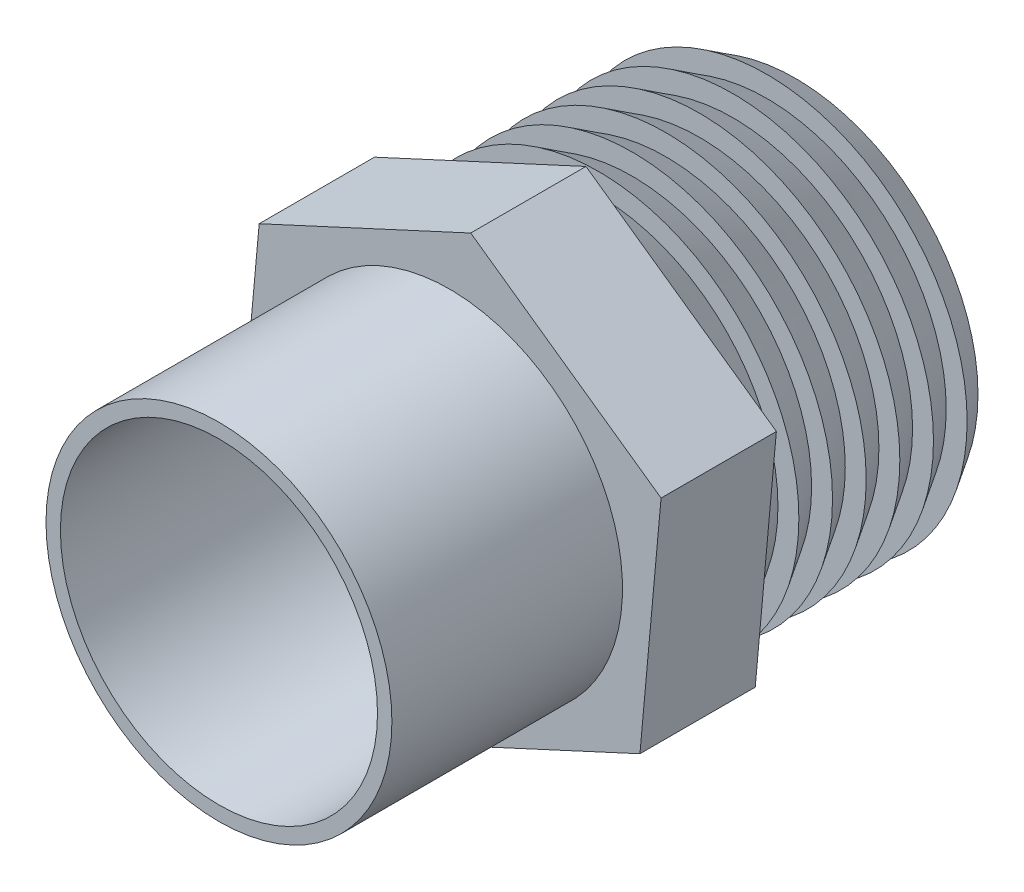
ISO-10303-21;
HEADER;
FILE_DESCRIPTION(('STEP AP214'),'2;1');
FILE_NAME('part.step','',(''),(''),'','','');
FILE_SCHEMA(('AUTOMOTIVE_DESIGN { 1 0 10303 214 1 1 1 1 }'));
ENDSEC;
DATA;
#1=APPLICATION_CONTEXT('core data for automotive mechanical design processes');
#2=APPLICATION_PROTOCOL_DEFINITION('international standard','automotive_design',2000,#1);
#3=PRODUCT_CONTEXT('',#1,'mechanical');
#4=PRODUCT('Part','Part','',(#3));
#5=PRODUCT_RELATED_PRODUCT_CATEGORY('part','',(#4));
#6=PRODUCT_DEFINITION_FORMATION('','',#4);
#7=PRODUCT_DEFINITION_CONTEXT('part definition',#1,'design');
#8=PRODUCT_DEFINITION('design','',#6,#7);
#9=PRODUCT_DEFINITION_SHAPE('','',#8);
#10=(LENGTH_UNIT() NAMED_UNIT(*) SI_UNIT(.MILLI.,.METRE.));
#11=(NAMED_UNIT(*) PLANE_ANGLE_UNIT() SI_UNIT($,.RADIAN.));
#12=(NAMED_UNIT(*) SI_UNIT($,.STERADIAN.) SOLID_ANGLE_UNIT());
#13=UNCERTAINTY_MEASURE_WITH_UNIT(LENGTH_MEASURE(1.E-05),#10,'distance_accuracy_value','');
#14=(GEOMETRIC_REPRESENTATION_CONTEXT(3) GLOBAL_UNCERTAINTY_ASSIGNED_CONTEXT((#13)) GLOBAL_UNIT_ASSIGNED_CONTEXT((#10,
#11,#12)) REPRESENTATION_CONTEXT('',''));
#15=CARTESIAN_POINT('',(0.,0.,0.));
#16=DIRECTION('',(0.,0.,1.));
#17=DIRECTION('',(1.,0.,0.));
#18=AXIS2_PLACEMENT_3D('',#15,#16,#17);
#19=CARTESIAN_POINT('',(0.,0.,12.7));
#20=DIRECTION('',(0.,0.,1.));
#21=DIRECTION('',(1.,0.,0.));
#22=AXIS2_PLACEMENT_3D('',#19,#20,#21);
#23=PLANE('',#22);
#24=CARTESIAN_POINT('',(0.,0.,12.7));
#25=DIRECTION('',(0.,0.,1.));
#26=DIRECTION('',(1.,0.,0.));
#27=AXIS2_PLACEMENT_3D('',#24,#25,#26);
#28=CIRCLE('',#27,9.525);
#29=CARTESIAN_POINT('',(9.525,0.,12.7));
#30=VERTEX_POINT('',#29);
#31=EDGE_CURVE('E43',#30,#30,#28,.T.);
#32=ORIENTED_EDGE('',*,*,#31,.T.);
#33=EDGE_LOOP('',(#32));
#34=FACE_BOUND('',#33,.T.);
#35=CARTESIAN_POINT('',(0.,0.,12.7));
#36=DIRECTION('',(0.,0.,1.));
#37=DIRECTION('',(1.,0.,0.));
#38=AXIS2_PLACEMENT_3D('',#35,#36,#37);
#39=CIRCLE('',#38,8.73125);
#40=CARTESIAN_POINT('',(8.73125,0.,12.7));
#41=VERTEX_POINT('',#40);
#42=EDGE_CURVE('E143',#41,#41,#39,.T.);
#43=ORIENTED_EDGE('',*,*,#42,.F.);
#44=EDGE_LOOP('',(#43));
#45=FACE_BOUND('',#44,.T.);
#46=ADVANCED_FACE('F34',(#34,#45),#23,.T.);
#47=CARTESIAN_POINT('',(0.,0.,12.7));
#48=DIRECTION('',(0.,0.,-1.));
#49=DIRECTION('',(-1.,0.,0.));
#50=AXIS2_PLACEMENT_3D('',#47,#48,#49);
#51=CYLINDRICAL_SURFACE('',#50,9.525);
#52=ORIENTED_EDGE('',*,*,#31,.F.);
#53=EDGE_LOOP('',(#52));
#54=FACE_BOUND('',#53,.T.);
#55=CARTESIAN_POINT('',(0.,0.,0.));
#56=DIRECTION('',(0.,0.,-1.));
#57=DIRECTION('',(-1.,0.,0.));
#58=AXIS2_PLACEMENT_3D('',#55,#56,#57);
#59=CIRCLE('',#58,9.525);
#60=CARTESIAN_POINT('',(-9.525,0.,0.));
#61=VERTEX_POINT('',#60);
#62=EDGE_CURVE('E140',#61,#61,#59,.T.);
#63=ORIENTED_EDGE('',*,*,#62,.F.);
#64=EDGE_LOOP('',(#63));
#65=FACE_BOUND('',#64,.T.);
#66=ADVANCED_FACE('F36',(#54,#65),#51,.T.);
#67=CARTESIAN_POINT('',(0.,0.,12.7));
#68=DIRECTION('',(0.,0.,-1.));
#69=DIRECTION('',(-1.,0.,0.));
#70=AXIS2_PLACEMENT_3D('',#67,#68,#69);
#71=CYLINDRICAL_SURFACE('',#70,8.73125);
#72=ORIENTED_EDGE('',*,*,#42,.T.);
#73=EDGE_LOOP('',(#72));
#74=FACE_BOUND('',#73,.T.);
#75=CARTESIAN_POINT('',(0.,0.,-19.05));
#76=DIRECTION('',(0.,0.,1.));
#77=DIRECTION('',(1.,0.,0.));
#78=AXIS2_PLACEMENT_3D('',#75,#76,#77);
#79=CIRCLE('',#78,8.73125);
#80=CARTESIAN_POINT('',(8.73125,0.,-19.05));
#81=VERTEX_POINT('',#80);
#82=EDGE_CURVE('E258',#81,#81,#79,.T.);
#83=ORIENTED_EDGE('',*,*,#82,.F.);
#84=EDGE_LOOP('',(#83));
#85=FACE_BOUND('',#84,.T.);
#86=ADVANCED_FACE('F152',(#74,#85),#71,.F.);
#87=CARTESIAN_POINT('',(0.,0.,0.));
#88=DIRECTION('',(0.,0.,-1.));
#89=DIRECTION('',(-1.,0.,0.));
#90=AXIS2_PLACEMENT_3D('',#87,#88,#89);
#91=PLANE('',#90);
#92=DIRECTION('',(-0.0907556399285297,-0.995873191636949,0.));
#93=VECTOR('',#92,1.);
#94=CARTESIAN_POINT('',(11.6489113183696,5.38080602048569,0.));
#95=LINE('',#94,#93);
#96=CARTESIAN_POINT('',(11.6489113183696,5.38080602048569,0.));
#97=VERTEX_POINT('',#96);
#98=CARTESIAN_POINT('',(10.4843703657616,-7.39785011789726,0.));
#99=VERTEX_POINT('',#98);
#100=EDGE_CURVE('E120',#97,#99,#95,.T.);
#101=ORIENTED_EDGE('',*,*,#100,.F.);
#102=DIRECTION('',(0.817073662941221,-0.576533285533295,0.));
#103=VECTOR('',#102,1.);
#104=CARTESIAN_POINT('',(1.16454095260791,12.778656138383,0.));
#105=LINE('',#104,#103);
#106=CARTESIAN_POINT('',(1.16454095260791,12.778656138383,0.));
#107=VERTEX_POINT('',#106);
#108=EDGE_CURVE('E80',#107,#97,#105,.T.);
#109=ORIENTED_EDGE('',*,*,#108,.F.);
#110=DIRECTION('',(0.907829302869751,0.419339906103654,0.));
#111=VECTOR('',#110,1.);
#112=CARTESIAN_POINT('',(-10.4843703657616,7.39785011789727,0.));
#113=LINE('',#112,#111);
#114=CARTESIAN_POINT('',(-10.4843703657616,7.39785011789727,0.));
#115=VERTEX_POINT('',#114);
#116=EDGE_CURVE('E74',#115,#107,#113,.T.);
#117=ORIENTED_EDGE('',*,*,#116,.F.);
#118=DIRECTION('',(0.0907556399285298,0.995873191636949,0.));
#119=VECTOR('',#118,1.);
#120=CARTESIAN_POINT('',(-11.6489113183696,-5.38080602048569,0.));
#121=LINE('',#120,#119);
#122=CARTESIAN_POINT('',(-11.6489113183696,-5.38080602048569,0.));
#123=VERTEX_POINT('',#122);
#124=EDGE_CURVE('E110',#123,#115,#121,.T.);
#125=ORIENTED_EDGE('',*,*,#124,.F.);
#126=DIRECTION('',(-0.817073662941221,0.576533285533295,0.));
#127=VECTOR('',#126,1.);
#128=CARTESIAN_POINT('',(-1.16454095260791,-12.778656138383,0.));
#129=LINE('',#128,#127);
#130=CARTESIAN_POINT('',(-1.16454095260791,-12.778656138383,0.));
#131=VERTEX_POINT('',#130);
#132=EDGE_CURVE('E126',#131,#123,#129,.T.);
#133=ORIENTED_EDGE('',*,*,#132,.F.);
#134=DIRECTION('',(-0.907829302869751,-0.419339906103655,0.));
#135=VECTOR('',#134,1.);
#136=CARTESIAN_POINT('',(10.4843703657616,-7.39785011789726,0.));
#137=LINE('',#136,#135);
#138=EDGE_CURVE('E123',#99,#131,#137,.T.);
#139=ORIENTED_EDGE('',*,*,#138,.F.);
#140=EDGE_LOOP('',(#101,#109,#117,#125,#133,#139));
#141=FACE_BOUND('',#140,.T.);
#142=ORIENTED_EDGE('',*,*,#62,.T.);
#143=EDGE_LOOP('',(#142));
#144=FACE_BOUND('',#143,.T.);
#145=ADVANCED_FACE('F155',(#141,#144),#91,.F.);
#146=CARTESIAN_POINT('',(11.6489113183696,5.38080602048569,-6.35));
#147=DIRECTION('',(-0.995873191636949,0.0907556399285297,0.));
#148=DIRECTION('',(-0.0907556399285297,-0.995873191636949,0.));
#149=AXIS2_PLACEMENT_3D('',#146,#147,#148);
#150=PLANE('',#149);
#151=ORIENTED_EDGE('',*,*,#100,.T.);
#152=DIRECTION('',(0.,0.,1.));
#153=VECTOR('',#152,1.);
#154=CARTESIAN_POINT('',(10.4843703657616,-7.39785011789726,-6.35));
#155=LINE('',#154,#153);
#156=CARTESIAN_POINT('',(10.4843703657616,-7.39785011789726,-6.35));
#157=VERTEX_POINT('',#156);
#158=EDGE_CURVE('E138',#157,#99,#155,.T.);
#159=ORIENTED_EDGE('',*,*,#158,.F.);
#160=DIRECTION('',(-0.0907556399285297,-0.995873191636949,0.));
#161=VECTOR('',#160,1.);
#162=CARTESIAN_POINT('',(11.6489113183696,5.38080602048569,-6.35));
#163=LINE('',#162,#161);
#164=CARTESIAN_POINT('',(11.6489113183696,5.38080602048569,-6.35));
#165=VERTEX_POINT('',#164);
#166=EDGE_CURVE('E131',#165,#157,#163,.T.);
#167=ORIENTED_EDGE('',*,*,#166,.F.);
#168=DIRECTION('',(0.,0.,1.));
#169=VECTOR('',#168,1.);
#170=CARTESIAN_POINT('',(11.6489113183696,5.38080602048569,-6.35));
#171=LINE('',#170,#169);
#172=EDGE_CURVE('E116',#165,#97,#171,.T.);
#173=ORIENTED_EDGE('',*,*,#172,.T.);
#174=EDGE_LOOP('',(#151,#159,#167,#173));
#175=FACE_BOUND('',#174,.T.);
#176=ADVANCED_FACE('F157',(#175),#150,.F.);
#177=CARTESIAN_POINT('',(10.4843703657616,-7.39785011789726,-6.35));
#178=DIRECTION('',(-0.419339906103655,0.907829302869751,0.));
#179=DIRECTION('',(-0.907829302869751,-0.419339906103655,0.));
#180=AXIS2_PLACEMENT_3D('',#177,#178,#179);
#181=PLANE('',#180);
#182=ORIENTED_EDGE('',*,*,#138,.T.);
#183=DIRECTION('',(0.,0.,1.));
#184=VECTOR('',#183,1.);
#185=CARTESIAN_POINT('',(-1.16454095260791,-12.778656138383,-6.35));
#186=LINE('',#185,#184);
#187=CARTESIAN_POINT('',(-1.16454095260791,-12.778656138383,-6.35));
#188=VERTEX_POINT('',#187);
#189=EDGE_CURVE('E135',#188,#131,#186,.T.);
#190=ORIENTED_EDGE('',*,*,#189,.F.);
#191=DIRECTION('',(-0.907829302869751,-0.419339906103655,0.));
#192=VECTOR('',#191,1.);
#193=CARTESIAN_POINT('',(10.4843703657616,-7.39785011789726,-6.35));
#194=LINE('',#193,#192);
#195=EDGE_CURVE('E89',#157,#188,#194,.T.);
#196=ORIENTED_EDGE('',*,*,#195,.F.);
#197=ORIENTED_EDGE('',*,*,#158,.T.);
#198=EDGE_LOOP('',(#182,#190,#196,#197));
#199=FACE_BOUND('',#198,.T.);
#200=ADVANCED_FACE('F164',(#199),#181,.F.);
#201=CARTESIAN_POINT('',(-1.16454095260791,-12.778656138383,-6.35));
#202=DIRECTION('',(0.576533285533295,0.817073662941221,0.));
#203=DIRECTION('',(-0.817073662941221,0.576533285533295,0.));
#204=AXIS2_PLACEMENT_3D('',#201,#202,#203);
#205=PLANE('',#204);
#206=ORIENTED_EDGE('',*,*,#132,.T.);
#207=DIRECTION('',(0.,0.,1.));
#208=VECTOR('',#207,1.);
#209=CARTESIAN_POINT('',(-11.6489113183696,-5.38080602048569,-6.35));
#210=LINE('',#209,#208);
#211=CARTESIAN_POINT('',(-11.6489113183696,-5.38080602048569,-6.35));
#212=VERTEX_POINT('',#211);
#213=EDGE_CURVE('E111',#212,#123,#210,.T.);
#214=ORIENTED_EDGE('',*,*,#213,.F.);
#215=DIRECTION('',(-0.817073662941221,0.576533285533295,0.));
#216=VECTOR('',#215,1.);
#217=CARTESIAN_POINT('',(-1.16454095260791,-12.778656138383,-6.35));
#218=LINE('',#217,#216);
#219=EDGE_CURVE('E102',#188,#212,#218,.T.);
#220=ORIENTED_EDGE('',*,*,#219,.F.);
#221=ORIENTED_EDGE('',*,*,#189,.T.);
#222=EDGE_LOOP('',(#206,#214,#220,#221));
#223=FACE_BOUND('',#222,.T.);
#224=ADVANCED_FACE('F178',(#223),#205,.F.);
#225=CARTESIAN_POINT('',(-11.6489113183696,-5.38080602048569,-6.35));
#226=DIRECTION('',(0.995873191636949,-0.0907556399285298,0.));
#227=DIRECTION('',(0.0907556399285298,0.995873191636949,0.));
#228=AXIS2_PLACEMENT_3D('',#225,#226,#227);
#229=PLANE('',#228);
#230=ORIENTED_EDGE('',*,*,#124,.T.);
#231=DIRECTION('',(0.,0.,1.));
#232=VECTOR('',#231,1.);
#233=CARTESIAN_POINT('',(-10.4843703657616,7.39785011789727,-6.35));
#234=LINE('',#233,#232);
#235=CARTESIAN_POINT('',(-10.4843703657616,7.39785011789727,-6.35));
#236=VERTEX_POINT('',#235);
#237=EDGE_CURVE('E107',#236,#115,#234,.T.);
#238=ORIENTED_EDGE('',*,*,#237,.F.);
#239=DIRECTION('',(0.0907556399285298,0.995873191636949,0.));
#240=VECTOR('',#239,1.);
#241=CARTESIAN_POINT('',(-11.6489113183696,-5.38080602048569,-6.35));
#242=LINE('',#241,#240);
#243=EDGE_CURVE('E96',#212,#236,#242,.T.);
#244=ORIENTED_EDGE('',*,*,#243,.F.);
#245=ORIENTED_EDGE('',*,*,#213,.T.);
#246=EDGE_LOOP('',(#230,#238,#244,#245));
#247=FACE_BOUND('',#246,.T.);
#248=ADVANCED_FACE('F108',(#247),#229,.F.);
#249=CARTESIAN_POINT('',(-10.4843703657616,7.39785011789727,-6.35));
#250=DIRECTION('',(0.419339906103654,-0.907829302869751,0.));
#251=DIRECTION('',(0.907829302869751,0.419339906103654,0.));
#252=AXIS2_PLACEMENT_3D('',#249,#250,#251);
#253=PLANE('',#252);
#254=ORIENTED_EDGE('',*,*,#116,.T.);
#255=DIRECTION('',(0.,0.,1.));
#256=VECTOR('',#255,1.);
#257=CARTESIAN_POINT('',(1.16454095260791,12.778656138383,-6.35));
#258=LINE('',#257,#256);
#259=CARTESIAN_POINT('',(1.16454095260791,12.778656138383,-6.35));
#260=VERTEX_POINT('',#259);
#261=EDGE_CURVE('E112',#260,#107,#258,.T.);
#262=ORIENTED_EDGE('',*,*,#261,.F.);
#263=DIRECTION('',(0.907829302869751,0.419339906103654,0.));
#264=VECTOR('',#263,1.);
#265=CARTESIAN_POINT('',(-10.4843703657616,7.39785011789727,-6.35));
#266=LINE('',#265,#264);
#267=EDGE_CURVE('E100',#236,#260,#266,.T.);
#268=ORIENTED_EDGE('',*,*,#267,.F.);
#269=ORIENTED_EDGE('',*,*,#237,.T.);
#270=EDGE_LOOP('',(#254,#262,#268,#269));
#271=FACE_BOUND('',#270,.T.);
#272=ADVANCED_FACE('F114',(#271),#253,.F.);
#273=CARTESIAN_POINT('',(1.16454095260791,12.778656138383,-6.35));
#274=DIRECTION('',(-0.576533285533295,-0.817073662941221,0.));
#275=DIRECTION('',(0.817073662941222,-0.576533285533295,0.));
#276=AXIS2_PLACEMENT_3D('',#273,#274,#275);
#277=PLANE('',#276);
#278=ORIENTED_EDGE('',*,*,#108,.T.);
#279=ORIENTED_EDGE('',*,*,#172,.F.);
#280=DIRECTION('',(0.817073662941221,-0.576533285533295,0.));
#281=VECTOR('',#280,1.);
#282=CARTESIAN_POINT('',(1.16454095260791,12.778656138383,-6.35));
#283=LINE('',#282,#281);
#284=EDGE_CURVE('E51',#260,#165,#283,.T.);
#285=ORIENTED_EDGE('',*,*,#284,.F.);
#286=ORIENTED_EDGE('',*,*,#261,.T.);
#287=EDGE_LOOP('',(#278,#279,#285,#286));
#288=FACE_BOUND('',#287,.T.);
#289=ADVANCED_FACE('F185',(#288),#277,.F.);
#290=CARTESIAN_POINT('',(0.,0.,-6.35));
#291=DIRECTION('',(0.,0.,-1.));
#292=DIRECTION('',(-1.,0.,0.));
#293=AXIS2_PLACEMENT_3D('',#290,#291,#292);
#294=PLANE('',#293);
#295=CARTESIAN_POINT('',(0.,0.,-6.35));
#296=DIRECTION('',(0.,0.,-1.));
#297=DIRECTION('',(-1.,0.,0.));
#298=AXIS2_PLACEMENT_3D('',#295,#296,#297);
#299=CIRCLE('',#298,11.0345291820167);
#300=CARTESIAN_POINT('',(-11.0345291820167,0.,-6.35));
#301=VERTEX_POINT('',#300);
#302=EDGE_CURVE('E11',#301,#301,#299,.T.);
#303=ORIENTED_EDGE('',*,*,#302,.F.);
#304=EDGE_LOOP('',(#303));
#305=FACE_BOUND('',#304,.T.);
#306=ORIENTED_EDGE('',*,*,#166,.T.);
#307=ORIENTED_EDGE('',*,*,#195,.T.);
#308=ORIENTED_EDGE('',*,*,#219,.T.);
#309=ORIENTED_EDGE('',*,*,#243,.T.);
#310=ORIENTED_EDGE('',*,*,#267,.T.);
#311=ORIENTED_EDGE('',*,*,#284,.T.);
#312=EDGE_LOOP('',(#306,#307,#308,#309,#310,#311));
#313=FACE_BOUND('',#312,.T.);
#314=ADVANCED_FACE('F98',(#305,#313),#294,.T.);
#315=CARTESIAN_POINT('',(0.,0.,-19.05));
#316=DIRECTION('',(0.,0.,-1.));
#317=DIRECTION('',(-1.,0.,0.));
#318=AXIS2_PLACEMENT_3D('',#315,#316,#317);
#319=PLANE('',#318);
#320=ORIENTED_EDGE('',*,*,#82,.T.);
#321=EDGE_LOOP('',(#320));
#322=FACE_BOUND('',#321,.T.);
#323=CARTESIAN_POINT('',(0.,0.,-19.05));
#324=DIRECTION('',(0.,0.,1.));
#325=DIRECTION('',(1.,0.,0.));
#326=AXIS2_PLACEMENT_3D('',#323,#324,#325);
#327=CIRCLE('',#326,10.0529402397785);
#328=CARTESIAN_POINT('',(10.0529402397785,0.,-19.05));
#329=VERTEX_POINT('',#328);
#330=EDGE_CURVE('E124',#329,#329,#327,.T.);
#331=ORIENTED_EDGE('',*,*,#330,.F.);
#332=EDGE_LOOP('',(#331));
#333=FACE_BOUND('',#332,.T.);
#334=ADVANCED_FACE('F190',(#322,#333),#319,.T.);
#335=CARTESIAN_POINT('',(0.,0.,-17.4702881969532));
#336=DIRECTION('',(0.,0.,1.));
#337=DIRECTION('',(1.,0.,0.));
#338=AXIS2_PLACEMENT_3D('',#335,#336,#337);
#339=CONICAL_SURFACE('',#338,11.0345291820167,0.555986280125754);
#340=ORIENTED_EDGE('',*,*,#330,.T.);
#341=EDGE_LOOP('',(#340));
#342=FACE_BOUND('',#341,.T.);
#343=CARTESIAN_POINT('',(0.,0.,-17.4702881969532));
#344=DIRECTION('',(0.,0.,1.));
#345=DIRECTION('',(1.,0.,0.));
#346=AXIS2_PLACEMENT_3D('',#343,#344,#345);
#347=CIRCLE('',#346,11.0345291820167);
#348=CARTESIAN_POINT('',(11.0345291820167,0.,-17.4702881969532));
#349=VERTEX_POINT('',#348);
#350=EDGE_CURVE('E292',#349,#349,#347,.T.);
#351=ORIENTED_EDGE('',*,*,#350,.F.);
#352=EDGE_LOOP('',(#351));
#353=FACE_BOUND('',#352,.T.);
#354=ADVANCED_FACE('F195',(#342,#353),#339,.T.);
#355=CARTESIAN_POINT('',(0.,0.,-17.4702881969532));
#356=DIRECTION('',(0.,0.,1.));
#357=DIRECTION('',(1.,0.,0.));
#358=AXIS2_PLACEMENT_3D('',#355,#356,#357);
#359=PLANE('',#358);
#360=ORIENTED_EDGE('',*,*,#350,.T.);
#361=EDGE_LOOP('',(#360));
#362=FACE_BOUND('',#361,.T.);
#363=CARTESIAN_POINT('',(0.,0.,-17.4702881969532));
#364=DIRECTION('',(0.,0.,1.));
#365=DIRECTION('',(1.,0.,0.));
#366=AXIS2_PLACEMENT_3D('',#363,#364,#365);
#367=CIRCLE('',#366,9.88288959100835);
#368=CARTESIAN_POINT('',(9.88288959100835,0.,-17.4702881969532));
#369=VERTEX_POINT('',#368);
#370=EDGE_CURVE('E289',#369,#369,#367,.T.);
#371=ORIENTED_EDGE('',*,*,#370,.F.);
#372=EDGE_LOOP('',(#371));
#373=FACE_BOUND('',#372,.T.);
#374=ADVANCED_FACE('F202',(#362,#373),#359,.T.);
#375=CARTESIAN_POINT('',(0.,0.,-15.6169068307944));
#376=DIRECTION('',(0.,0.,1.));
#377=DIRECTION('',(1.,0.,0.));
#378=AXIS2_PLACEMENT_3D('',#375,#376,#377);
#379=CONICAL_SURFACE('',#378,11.0345291820167,0.555986280125753);
#380=ORIENTED_EDGE('',*,*,#370,.T.);
#381=EDGE_LOOP('',(#380));
#382=FACE_BOUND('',#381,.T.);
#383=CARTESIAN_POINT('',(0.,0.,-15.6169068307944));
#384=DIRECTION('',(0.,0.,1.));
#385=DIRECTION('',(1.,0.,0.));
#386=AXIS2_PLACEMENT_3D('',#383,#384,#385);
#387=CIRCLE('',#386,11.0345291820167);
#388=CARTESIAN_POINT('',(11.0345291820167,0.,-15.6169068307944));
#389=VERTEX_POINT('',#388);
#390=EDGE_CURVE('E286',#389,#389,#387,.T.);
#391=ORIENTED_EDGE('',*,*,#390,.F.);
#392=EDGE_LOOP('',(#391));
#393=FACE_BOUND('',#392,.T.);
#394=ADVANCED_FACE('F206',(#382,#393),#379,.T.);
#395=CARTESIAN_POINT('',(0.,0.,-15.6169068307944));
#396=DIRECTION('',(0.,0.,1.));
#397=DIRECTION('',(1.,0.,0.));
#398=AXIS2_PLACEMENT_3D('',#395,#396,#397);
#399=PLANE('',#398);
#400=ORIENTED_EDGE('',*,*,#390,.T.);
#401=EDGE_LOOP('',(#400));
#402=FACE_BOUND('',#401,.T.);
#403=CARTESIAN_POINT('',(0.,0.,-15.6169068307944));
#404=DIRECTION('',(0.,0.,1.));
#405=DIRECTION('',(1.,0.,0.));
#406=AXIS2_PLACEMENT_3D('',#403,#404,#405);
#407=CIRCLE('',#406,9.88288959100835);
#408=CARTESIAN_POINT('',(9.88288959100835,0.,-15.6169068307944));
#409=VERTEX_POINT('',#408);
#410=EDGE_CURVE('E283',#409,#409,#407,.T.);
#411=ORIENTED_EDGE('',*,*,#410,.F.);
#412=EDGE_LOOP('',(#411));
#413=FACE_BOUND('',#412,.T.);
#414=ADVANCED_FACE('F210',(#402,#413),#399,.T.);
#415=CARTESIAN_POINT('',(0.,0.,-13.7635254646355));
#416=DIRECTION('',(0.,0.,1.));
#417=DIRECTION('',(1.,0.,0.));
#418=AXIS2_PLACEMENT_3D('',#415,#416,#417);
#419=CONICAL_SURFACE('',#418,11.0345291820167,0.555986280125755);
#420=ORIENTED_EDGE('',*,*,#410,.T.);
#421=EDGE_LOOP('',(#420));
#422=FACE_BOUND('',#421,.T.);
#423=CARTESIAN_POINT('',(0.,0.,-13.7635254646355));
#424=DIRECTION('',(0.,0.,1.));
#425=DIRECTION('',(1.,0.,0.));
#426=AXIS2_PLACEMENT_3D('',#423,#424,#425);
#427=CIRCLE('',#426,11.0345291820167);
#428=CARTESIAN_POINT('',(11.0345291820167,0.,-13.7635254646355));
#429=VERTEX_POINT('',#428);
#430=EDGE_CURVE('E280',#429,#429,#427,.T.);
#431=ORIENTED_EDGE('',*,*,#430,.F.);
#432=EDGE_LOOP('',(#431));
#433=FACE_BOUND('',#432,.T.);
#434=ADVANCED_FACE('F214',(#422,#433),#419,.T.);
#435=CARTESIAN_POINT('',(0.,0.,-13.7635254646355));
#436=DIRECTION('',(0.,0.,1.));
#437=DIRECTION('',(1.,0.,0.));
#438=AXIS2_PLACEMENT_3D('',#435,#436,#437);
#439=PLANE('',#438);
#440=ORIENTED_EDGE('',*,*,#430,.T.);
#441=EDGE_LOOP('',(#440));
#442=FACE_BOUND('',#441,.T.);
#443=CARTESIAN_POINT('',(0.,0.,-13.7635254646355));
#444=DIRECTION('',(0.,0.,1.));
#445=DIRECTION('',(1.,0.,0.));
#446=AXIS2_PLACEMENT_3D('',#443,#444,#445);
#447=CIRCLE('',#446,9.88288959100835);
#448=CARTESIAN_POINT('',(9.88288959100835,0.,-13.7635254646355));
#449=VERTEX_POINT('',#448);
#450=EDGE_CURVE('E277',#449,#449,#447,.T.);
#451=ORIENTED_EDGE('',*,*,#450,.F.);
#452=EDGE_LOOP('',(#451));
#453=FACE_BOUND('',#452,.T.);
#454=ADVANCED_FACE('F218',(#442,#453),#439,.T.);
#455=CARTESIAN_POINT('',(0.,0.,-11.9101440984766));
#456=DIRECTION('',(0.,0.,1.));
#457=DIRECTION('',(1.,0.,0.));
#458=AXIS2_PLACEMENT_3D('',#455,#456,#457);
#459=CONICAL_SURFACE('',#458,11.0345291820167,0.555986280125754);
#460=ORIENTED_EDGE('',*,*,#450,.T.);
#461=EDGE_LOOP('',(#460));
#462=FACE_BOUND('',#461,.T.);
#463=CARTESIAN_POINT('',(0.,0.,-11.9101440984766));
#464=DIRECTION('',(0.,0.,1.));
#465=DIRECTION('',(1.,0.,0.));
#466=AXIS2_PLACEMENT_3D('',#463,#464,#465);
#467=CIRCLE('',#466,11.0345291820167);
#468=CARTESIAN_POINT('',(11.0345291820167,0.,-11.9101440984766));
#469=VERTEX_POINT('',#468);
#470=EDGE_CURVE('E274',#469,#469,#467,.T.);
#471=ORIENTED_EDGE('',*,*,#470,.F.);
#472=EDGE_LOOP('',(#471));
#473=FACE_BOUND('',#472,.T.);
#474=ADVANCED_FACE('F222',(#462,#473),#459,.T.);
#475=CARTESIAN_POINT('',(0.,0.,-11.9101440984766));
#476=DIRECTION('',(0.,0.,1.));
#477=DIRECTION('',(1.,0.,0.));
#478=AXIS2_PLACEMENT_3D('',#475,#476,#477);
#479=PLANE('',#478);
#480=ORIENTED_EDGE('',*,*,#470,.T.);
#481=EDGE_LOOP('',(#480));
#482=FACE_BOUND('',#481,.T.);
#483=CARTESIAN_POINT('',(0.,0.,-11.9101440984766));
#484=DIRECTION('',(0.,0.,1.));
#485=DIRECTION('',(1.,0.,0.));
#486=AXIS2_PLACEMENT_3D('',#483,#484,#485);
#487=CIRCLE('',#486,9.88288959100835);
#488=CARTESIAN_POINT('',(9.88288959100835,0.,-11.9101440984766));
#489=VERTEX_POINT('',#488);
#490=EDGE_CURVE('E271',#489,#489,#487,.T.);
#491=ORIENTED_EDGE('',*,*,#490,.F.);
#492=EDGE_LOOP('',(#491));
#493=FACE_BOUND('',#492,.T.);
#494=ADVANCED_FACE('F226',(#482,#493),#479,.T.);
#495=CARTESIAN_POINT('',(0.,0.,-10.0567627323177));
#496=DIRECTION('',(0.,0.,1.));
#497=DIRECTION('',(1.,0.,0.));
#498=AXIS2_PLACEMENT_3D('',#495,#496,#497);
#499=CONICAL_SURFACE('',#498,11.0345291820167,0.555986280125754);
#500=ORIENTED_EDGE('',*,*,#490,.T.);
#501=EDGE_LOOP('',(#500));
#502=FACE_BOUND('',#501,.T.);
#503=CARTESIAN_POINT('',(0.,0.,-10.0567627323177));
#504=DIRECTION('',(0.,0.,1.));
#505=DIRECTION('',(1.,0.,0.));
#506=AXIS2_PLACEMENT_3D('',#503,#504,#505);
#507=CIRCLE('',#506,11.0345291820167);
#508=CARTESIAN_POINT('',(11.0345291820167,0.,-10.0567627323177));
#509=VERTEX_POINT('',#508);
#510=EDGE_CURVE('E268',#509,#509,#507,.T.);
#511=ORIENTED_EDGE('',*,*,#510,.F.);
#512=EDGE_LOOP('',(#511));
#513=FACE_BOUND('',#512,.T.);
#514=ADVANCED_FACE('F230',(#502,#513),#499,.T.);
#515=CARTESIAN_POINT('',(0.,0.,-10.0567627323177));
#516=DIRECTION('',(0.,0.,1.));
#517=DIRECTION('',(1.,0.,0.));
#518=AXIS2_PLACEMENT_3D('',#515,#516,#517);
#519=PLANE('',#518);
#520=ORIENTED_EDGE('',*,*,#510,.T.);
#521=EDGE_LOOP('',(#520));
#522=FACE_BOUND('',#521,.T.);
#523=CARTESIAN_POINT('',(0.,0.,-10.0567627323177));
#524=DIRECTION('',(0.,0.,1.));
#525=DIRECTION('',(1.,0.,0.));
#526=AXIS2_PLACEMENT_3D('',#523,#524,#525);
#527=CIRCLE('',#526,9.88288959100835);
#528=CARTESIAN_POINT('',(9.88288959100835,0.,-10.0567627323177));
#529=VERTEX_POINT('',#528);
#530=EDGE_CURVE('E261',#529,#529,#527,.T.);
#531=ORIENTED_EDGE('',*,*,#530,.F.);
#532=EDGE_LOOP('',(#531));
#533=FACE_BOUND('',#532,.T.);
#534=ADVANCED_FACE('F234',(#522,#533),#519,.T.);
#535=CARTESIAN_POINT('',(0.,0.,-8.20338136615887));
#536=DIRECTION('',(0.,0.,1.));
#537=DIRECTION('',(1.,0.,0.));
#538=AXIS2_PLACEMENT_3D('',#535,#536,#537);
#539=CONICAL_SURFACE('',#538,11.0345291820167,0.555986280125753);
#540=ORIENTED_EDGE('',*,*,#530,.T.);
#541=EDGE_LOOP('',(#540));
#542=FACE_BOUND('',#541,.T.);
#543=CARTESIAN_POINT('',(0.,0.,-8.20338136615887));
#544=DIRECTION('',(0.,0.,1.));
#545=DIRECTION('',(1.,0.,0.));
#546=AXIS2_PLACEMENT_3D('',#543,#544,#545);
#547=CIRCLE('',#546,11.0345291820167);
#548=CARTESIAN_POINT('',(11.0345291820167,0.,-8.20338136615887));
#549=VERTEX_POINT('',#548);
#550=EDGE_CURVE('E257',#549,#549,#547,.T.);
#551=ORIENTED_EDGE('',*,*,#550,.F.);
#552=EDGE_LOOP('',(#551));
#553=FACE_BOUND('',#552,.T.);
#554=ADVANCED_FACE('F238',(#542,#553),#539,.T.);
#555=CARTESIAN_POINT('',(0.,0.,-8.20338136615887));
#556=DIRECTION('',(0.,0.,1.));
#557=DIRECTION('',(1.,0.,0.));
#558=AXIS2_PLACEMENT_3D('',#555,#556,#557);
#559=PLANE('',#558);
#560=ORIENTED_EDGE('',*,*,#550,.T.);
#561=EDGE_LOOP('',(#560));
#562=FACE_BOUND('',#561,.T.);
#563=CARTESIAN_POINT('',(0.,0.,-8.20338136615887));
#564=DIRECTION('',(0.,0.,1.));
#565=DIRECTION('',(1.,0.,0.));
#566=AXIS2_PLACEMENT_3D('',#563,#564,#565);
#567=CIRCLE('',#566,9.88288959100835);
#568=CARTESIAN_POINT('',(9.88288959100835,0.,-8.20338136615887));
#569=VERTEX_POINT('',#568);
#570=EDGE_CURVE('E255',#569,#569,#567,.T.);
#571=ORIENTED_EDGE('',*,*,#570,.F.);
#572=EDGE_LOOP('',(#571));
#573=FACE_BOUND('',#572,.T.);
#574=ADVANCED_FACE('F242',(#562,#573),#559,.T.);
#575=CARTESIAN_POINT('',(0.,0.,-6.35));
#576=DIRECTION('',(0.,0.,1.));
#577=DIRECTION('',(1.,0.,0.));
#578=AXIS2_PLACEMENT_3D('',#575,#576,#577);
#579=CONICAL_SURFACE('',#578,11.0345291820167,0.555986280125754);
#580=ORIENTED_EDGE('',*,*,#570,.T.);
#581=EDGE_LOOP('',(#580));
#582=FACE_BOUND('',#581,.T.);
#583=ORIENTED_EDGE('',*,*,#302,.T.);
#584=EDGE_LOOP('',(#583));
#585=FACE_BOUND('',#584,.T.);
#586=ADVANCED_FACE('F246',(#582,#585),#579,.T.);
#587=CLOSED_SHELL('',(#46,#66,#86,#145,#176,#200,#224,#248,#272,#289,#314,#334,#354,#374,#394,
#414,#434,#454,#474,#494,#514,#534,#554,#574,#586));
#588=MANIFOLD_SOLID_BREP('B2',#587);
#589=ADVANCED_BREP_SHAPE_REPRESENTATION('',(#18,#588),#14);
#590=SHAPE_DEFINITION_REPRESENTATION(#9,#589);
ENDSEC;
END-ISO-10303-21;
